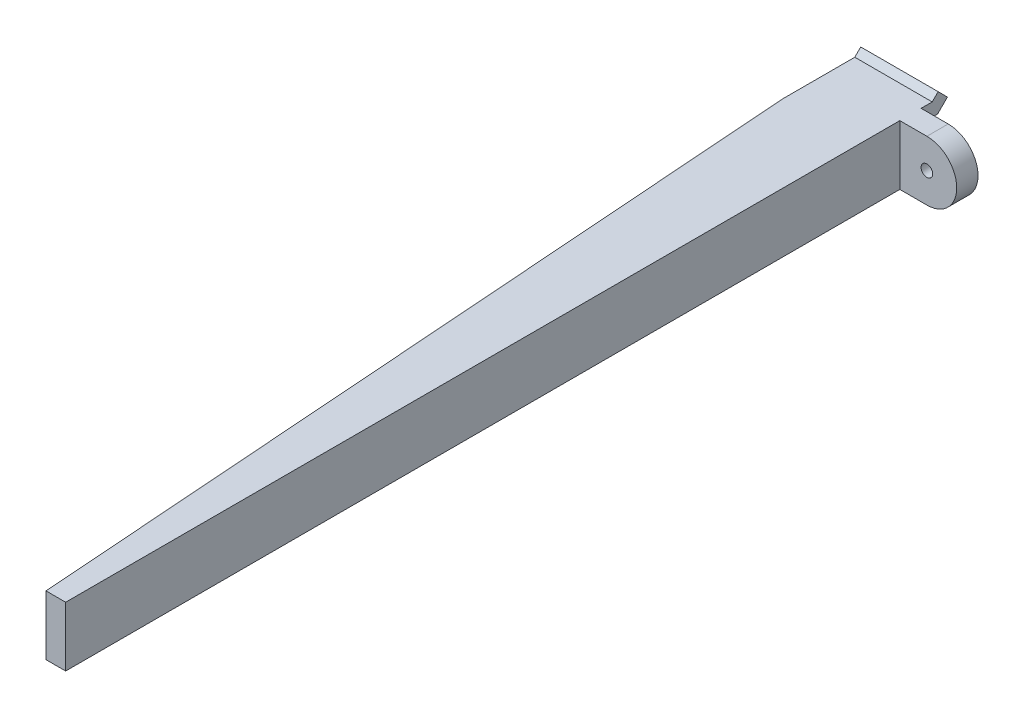
ISO-10303-21;
HEADER;
FILE_DESCRIPTION(('STEP AP214'),'2;1');
FILE_NAME('part.step','',(''),(''),'','','');
FILE_SCHEMA(('AUTOMOTIVE_DESIGN { 1 0 10303 214 1 1 1 1 }'));
ENDSEC;
DATA;
#1=APPLICATION_CONTEXT('core data for automotive mechanical design processes');
#2=APPLICATION_PROTOCOL_DEFINITION('international standard','automotive_design',2000,#1);
#3=PRODUCT_CONTEXT('',#1,'mechanical');
#4=PRODUCT('Part','Part','',(#3));
#5=PRODUCT_RELATED_PRODUCT_CATEGORY('part','',(#4));
#6=PRODUCT_DEFINITION_FORMATION('','',#4);
#7=PRODUCT_DEFINITION_CONTEXT('part definition',#1,'design');
#8=PRODUCT_DEFINITION('design','',#6,#7);
#9=PRODUCT_DEFINITION_SHAPE('','',#8);
#10=(LENGTH_UNIT() NAMED_UNIT(*) SI_UNIT(.MILLI.,.METRE.));
#11=(NAMED_UNIT(*) PLANE_ANGLE_UNIT() SI_UNIT($,.RADIAN.));
#12=(NAMED_UNIT(*) SI_UNIT($,.STERADIAN.) SOLID_ANGLE_UNIT());
#13=UNCERTAINTY_MEASURE_WITH_UNIT(LENGTH_MEASURE(1.E-05),#10,'distance_accuracy_value','');
#14=(GEOMETRIC_REPRESENTATION_CONTEXT(3) GLOBAL_UNCERTAINTY_ASSIGNED_CONTEXT((#13)) GLOBAL_UNIT_ASSIGNED_CONTEXT((#10,
#11,#12)) REPRESENTATION_CONTEXT('',''));
#15=CARTESIAN_POINT('',(0.,0.,0.));
#16=DIRECTION('',(0.,0.,1.));
#17=DIRECTION('',(1.,0.,0.));
#18=AXIS2_PLACEMENT_3D('',#15,#16,#17);
#19=CARTESIAN_POINT('',(5.,-5.8181568544759,5.));
#20=DIRECTION('',(-1.,0.,0.));
#21=DIRECTION('',(0.,0.,1.));
#22=AXIS2_PLACEMENT_3D('',#19,#20,#21);
#23=PLANE('',#22);
#24=DIRECTION('',(0.,0.,1.));
#25=VECTOR('',#24,1.);
#26=CARTESIAN_POINT('',(5.,5.77025558493729,-0.150000000000021));
#27=LINE('',#26,#25);
#28=CARTESIAN_POINT('',(5.,5.77025558493729,-1.43370490960979));
#29=VERTEX_POINT('',#28);
#30=CARTESIAN_POINT('',(5.,5.77025558493729,0.));
#31=VERTEX_POINT('',#30);
#32=EDGE_CURVE('E276',#29,#31,#27,.T.);
#33=ORIENTED_EDGE('',*,*,#32,.T.);
#34=DIRECTION('',(0.,-1.,0.));
#35=VECTOR('',#34,1.);
#36=CARTESIAN_POINT('',(5.,-1.92974441505666,0.));
#37=LINE('',#36,#35);
#38=CARTESIAN_POINT('',(5.,4.07025558493731,0.));
#39=VERTEX_POINT('',#38);
#40=EDGE_CURVE('E190',#31,#39,#37,.T.);
#41=ORIENTED_EDGE('',*,*,#40,.T.);
#42=DIRECTION('',(0.,-1.09865820145183E-13,-1.));
#43=VECTOR('',#42,1.);
#44=CARTESIAN_POINT('',(5.,4.07025558493731,0.));
#45=LINE('',#44,#43);
#46=CARTESIAN_POINT('',(5.,4.07025558493729,-2.13786796564405));
#47=VERTEX_POINT('',#46);
#48=EDGE_CURVE('E250',#39,#47,#45,.T.);
#49=ORIENTED_EDGE('',*,*,#48,.T.);
#50=DIRECTION('',(0.,0.707106781186548,-0.707106781186547));
#51=VECTOR('',#50,1.);
#52=CARTESIAN_POINT('',(5.,5.33446914731039,-3.40208152801715));
#53=LINE('',#52,#51);
#54=CARTESIAN_POINT('',(5.,5.33446914731039,-3.40208152801715));
#55=VERTEX_POINT('',#54);
#56=EDGE_CURVE('E248',#47,#55,#53,.T.);
#57=ORIENTED_EDGE('',*,*,#56,.T.);
#58=DIRECTION('',(0.,0.707106781186546,0.707106781186549));
#59=VECTOR('',#58,1.);
#60=CARTESIAN_POINT('',(5.,6.53655067532751,-2.20000000000002));
#61=LINE('',#60,#59);
#62=CARTESIAN_POINT('',(5.,6.53655067532751,-2.20000000000002));
#63=VERTEX_POINT('',#62);
#64=EDGE_CURVE('E245',#55,#63,#61,.T.);
#65=ORIENTED_EDGE('',*,*,#64,.T.);
#66=DIRECTION('',(0.,-0.707106781186548,0.707106781186547));
#67=VECTOR('',#66,1.);
#68=CARTESIAN_POINT('',(5.,5.77025558493729,-1.43370490960979));
#69=LINE('',#68,#67);
#70=EDGE_CURVE('E243',#63,#29,#69,.T.);
#71=ORIENTED_EDGE('',*,*,#70,.T.);
#72=EDGE_LOOP('',(#33,#41,#49,#57,#65,#71));
#73=FACE_BOUND('',#72,.T.);
#74=ADVANCED_FACE('F33',(#73),#23,.F.);
#75=DIRECTION('',(0.,0.,1.));
#76=VECTOR('',#75,1.);
#77=CARTESIAN_POINT('',(5.,-0.229744415062712,-0.150000000000021));
#78=LINE('',#77,#76);
#79=CARTESIAN_POINT('',(5.,-0.229744415062712,-1.43370490960979));
#80=VERTEX_POINT('',#79);
#81=CARTESIAN_POINT('',(5.,-0.229744415062712,0.));
#82=VERTEX_POINT('',#81);
#83=EDGE_CURVE('E216',#80,#82,#78,.T.);
#84=ORIENTED_EDGE('',*,*,#83,.T.);
#85=CARTESIAN_POINT('',(5.,-1.92974441505666,0.));
#86=VERTEX_POINT('',#85);
#87=EDGE_CURVE('E189',#82,#86,#37,.T.);
#88=ORIENTED_EDGE('',*,*,#87,.T.);
#89=DIRECTION('',(0.,-1.08420217248535E-13,-1.));
#90=VECTOR('',#89,1.);
#91=CARTESIAN_POINT('',(5.,-1.92974441506271,-0.150000000000021));
#92=LINE('',#91,#90);
#93=CARTESIAN_POINT('',(5.,-1.92974441506271,-2.13786796564406));
#94=VERTEX_POINT('',#93);
#95=EDGE_CURVE('E213',#86,#94,#92,.T.);
#96=ORIENTED_EDGE('',*,*,#95,.T.);
#97=DIRECTION('',(0.,0.707106781186549,-0.707106781186546));
#98=VECTOR('',#97,1.);
#99=CARTESIAN_POINT('',(5.,-0.665530852689616,-3.40208152801715));
#100=LINE('',#99,#98);
#101=CARTESIAN_POINT('',(5.,-0.665530852689616,-3.40208152801715));
#102=VERTEX_POINT('',#101);
#103=EDGE_CURVE('E211',#94,#102,#100,.T.);
#104=ORIENTED_EDGE('',*,*,#103,.T.);
#105=DIRECTION('',(0.,0.707106781186548,0.707106781186548));
#106=VECTOR('',#105,1.);
#107=CARTESIAN_POINT('',(5.,0.536550675327514,-2.20000000000002));
#108=LINE('',#107,#106);
#109=CARTESIAN_POINT('',(5.,0.536550675327514,-2.20000000000002));
#110=VERTEX_POINT('',#109);
#111=EDGE_CURVE('E208',#102,#110,#108,.T.);
#112=ORIENTED_EDGE('',*,*,#111,.T.);
#113=DIRECTION('',(0.,-0.707106781186546,0.707106781186549));
#114=VECTOR('',#113,1.);
#115=CARTESIAN_POINT('',(5.,-0.229744415062712,-1.43370490960979));
#116=LINE('',#115,#114);
#117=EDGE_CURVE('E206',#110,#80,#116,.T.);
#118=ORIENTED_EDGE('',*,*,#117,.T.);
#119=EDGE_LOOP('',(#84,#88,#96,#104,#112,#118));
#120=FACE_BOUND('',#119,.T.);
#121=ADVANCED_FACE('F323',(#120),#23,.F.);
#122=CARTESIAN_POINT('',(5.,5.77025558493729,2.75));
#123=VERTEX_POINT('',#122);
#124=CARTESIAN_POINT('',(5.,5.77025558493729,110.5));
#125=VERTEX_POINT('',#124);
#126=EDGE_CURVE('E252',#123,#125,#27,.T.);
#127=ORIENTED_EDGE('',*,*,#126,.T.);
#128=DIRECTION('',(0.,1.,0.));
#129=VECTOR('',#128,1.);
#130=CARTESIAN_POINT('',(5.,5.77025558493729,110.5));
#131=LINE('',#130,#129);
#132=CARTESIAN_POINT('',(5.,-1.92974441506156,110.5));
#133=VERTEX_POINT('',#132);
#134=EDGE_CURVE('E167',#133,#125,#131,.T.);
#135=ORIENTED_EDGE('',*,*,#134,.F.);
#136=CARTESIAN_POINT('',(5.,-1.9297444150624,2.75));
#137=VERTEX_POINT('',#136);
#138=EDGE_CURVE('E214',#133,#137,#92,.T.);
#139=ORIENTED_EDGE('',*,*,#138,.T.);
#140=DIRECTION('',(0.,-1.,0.));
#141=VECTOR('',#140,1.);
#142=CARTESIAN_POINT('',(5.,-1.92974441505666,2.75));
#143=LINE('',#142,#141);
#144=EDGE_CURVE('E55',#123,#137,#143,.T.);
#145=ORIENTED_EDGE('',*,*,#144,.F.);
#146=EDGE_LOOP('',(#127,#135,#139,#145));
#147=FACE_BOUND('',#146,.T.);
#148=ADVANCED_FACE('F35',(#147),#23,.F.);
#149=CARTESIAN_POINT('',(-5.,-5.8181568544759,5.));
#150=DIRECTION('',(1.,0.,0.));
#151=DIRECTION('',(0.,0.,-1.));
#152=AXIS2_PLACEMENT_3D('',#149,#150,#151);
#153=PLANE('',#152);
#154=DIRECTION('',(0.,1.08420217248535E-13,1.));
#155=VECTOR('',#154,1.);
#156=CARTESIAN_POINT('',(-5.,-1.92974441506271,-0.150000000000021));
#157=LINE('',#156,#155);
#158=CARTESIAN_POINT('',(-5.,-1.92974441506271,-2.13786796564406));
#159=VERTEX_POINT('',#158);
#160=CARTESIAN_POINT('',(-5.,-1.92974441505628,7.95281056443287));
#161=VERTEX_POINT('',#160);
#162=EDGE_CURVE('E228',#159,#161,#157,.T.);
#163=ORIENTED_EDGE('',*,*,#162,.T.);
#164=DIRECTION('',(0.,1.,0.));
#165=VECTOR('',#164,1.);
#166=CARTESIAN_POINT('',(-5.,-94.2297444150627,7.95281056443287));
#167=LINE('',#166,#165);
#168=CARTESIAN_POINT('',(-5.,5.77025558493729,7.95281056443287));
#169=VERTEX_POINT('',#168);
#170=EDGE_CURVE('E162',#161,#169,#167,.T.);
#171=ORIENTED_EDGE('',*,*,#170,.T.);
#172=DIRECTION('',(0.,0.,-1.));
#173=VECTOR('',#172,1.);
#174=CARTESIAN_POINT('',(-5.,5.77025558493729,-0.150000000000021));
#175=LINE('',#174,#173);
#176=CARTESIAN_POINT('',(-5.,5.77025558493729,-1.43370490960979));
#177=VERTEX_POINT('',#176);
#178=EDGE_CURVE('E161',#169,#177,#175,.T.);
#179=ORIENTED_EDGE('',*,*,#178,.T.);
#180=DIRECTION('',(0.,0.707106781186548,-0.707106781186547));
#181=VECTOR('',#180,1.);
#182=CARTESIAN_POINT('',(-5.,5.77025558493729,-1.43370490960979));
#183=LINE('',#182,#181);
#184=CARTESIAN_POINT('',(-5.,6.53655067532751,-2.20000000000002));
#185=VERTEX_POINT('',#184);
#186=EDGE_CURVE('E254',#177,#185,#183,.T.);
#187=ORIENTED_EDGE('',*,*,#186,.T.);
#188=DIRECTION('',(0.,-0.707106781186546,-0.707106781186549));
#189=VECTOR('',#188,1.);
#190=CARTESIAN_POINT('',(-5.,6.53655067532751,-2.20000000000002));
#191=LINE('',#190,#189);
#192=CARTESIAN_POINT('',(-5.,5.33446914731039,-3.40208152801715));
#193=VERTEX_POINT('',#192);
#194=EDGE_CURVE('E257',#185,#193,#191,.T.);
#195=ORIENTED_EDGE('',*,*,#194,.T.);
#196=DIRECTION('',(0.,-0.707106781186548,0.707106781186547));
#197=VECTOR('',#196,1.);
#198=CARTESIAN_POINT('',(-5.,5.33446914731039,-3.40208152801715));
#199=LINE('',#198,#197);
#200=CARTESIAN_POINT('',(-5.,4.07025558493729,-2.13786796564405));
#201=VERTEX_POINT('',#200);
#202=EDGE_CURVE('E260',#193,#201,#199,.T.);
#203=ORIENTED_EDGE('',*,*,#202,.T.);
#204=DIRECTION('',(0.,1.09865820145183E-13,1.));
#205=VECTOR('',#204,1.);
#206=CARTESIAN_POINT('',(-5.,4.07025558493731,0.));
#207=LINE('',#206,#205);
#208=CARTESIAN_POINT('',(-5.,4.07025558493731,0.));
#209=VERTEX_POINT('',#208);
#210=EDGE_CURVE('E263',#201,#209,#207,.T.);
#211=ORIENTED_EDGE('',*,*,#210,.T.);
#212=DIRECTION('',(0.,-1.,0.));
#213=VECTOR('',#212,1.);
#214=CARTESIAN_POINT('',(-5.,-5.8181568544759,0.));
#215=LINE('',#214,#213);
#216=CARTESIAN_POINT('',(-5.,-0.229744415062696,0.));
#217=VERTEX_POINT('',#216);
#218=EDGE_CURVE('E41',#209,#217,#215,.T.);
#219=ORIENTED_EDGE('',*,*,#218,.T.);
#220=DIRECTION('',(0.,0.,-1.));
#221=VECTOR('',#220,1.);
#222=CARTESIAN_POINT('',(-5.,-0.229744415062712,-0.150000000000021));
#223=LINE('',#222,#221);
#224=CARTESIAN_POINT('',(-5.,-0.229744415062712,-1.43370490960979));
#225=VERTEX_POINT('',#224);
#226=EDGE_CURVE('E204',#217,#225,#223,.T.);
#227=ORIENTED_EDGE('',*,*,#226,.T.);
#228=DIRECTION('',(0.,0.707106781186546,-0.707106781186549));
#229=VECTOR('',#228,1.);
#230=CARTESIAN_POINT('',(-5.,-0.229744415062712,-1.43370490960979));
#231=LINE('',#230,#229);
#232=CARTESIAN_POINT('',(-5.,0.536550675327514,-2.20000000000002));
#233=VERTEX_POINT('',#232);
#234=EDGE_CURVE('E219',#225,#233,#231,.T.);
#235=ORIENTED_EDGE('',*,*,#234,.T.);
#236=DIRECTION('',(0.,-0.707106781186548,-0.707106781186548));
#237=VECTOR('',#236,1.);
#238=CARTESIAN_POINT('',(-5.,0.536550675327514,-2.20000000000002));
#239=LINE('',#238,#237);
#240=CARTESIAN_POINT('',(-5.,-0.665530852689616,-3.40208152801715));
#241=VERTEX_POINT('',#240);
#242=EDGE_CURVE('E222',#233,#241,#239,.T.);
#243=ORIENTED_EDGE('',*,*,#242,.T.);
#244=DIRECTION('',(0.,-0.707106781186549,0.707106781186546));
#245=VECTOR('',#244,1.);
#246=CARTESIAN_POINT('',(-5.,-0.665530852689616,-3.40208152801715));
#247=LINE('',#246,#245);
#248=EDGE_CURVE('E225',#241,#159,#247,.T.);
#249=ORIENTED_EDGE('',*,*,#248,.T.);
#250=EDGE_LOOP('',(#163,#171,#179,#187,#195,#203,#211,#219,#227,#235,#243,#249));
#251=FACE_BOUND('',#250,.T.);
#252=ADVANCED_FACE('F279',(#251),#153,.F.);
#253=CARTESIAN_POINT('',(0.,0.,0.));
#254=DIRECTION('',(0.,0.,-1.));
#255=DIRECTION('',(-1.,0.,0.));
#256=AXIS2_PLACEMENT_3D('',#253,#254,#255);
#257=PLANE('',#256);
#258=DIRECTION('',(-1.,0.,0.));
#259=VECTOR('',#258,1.);
#260=CARTESIAN_POINT('',(9.20199597764663,-0.229744415062696,0.));
#261=LINE('',#260,#259);
#262=EDGE_CURVE('E231',#82,#217,#261,.T.);
#263=ORIENTED_EDGE('',*,*,#262,.T.);
#264=ORIENTED_EDGE('',*,*,#218,.F.);
#265=DIRECTION('',(-1.,0.,0.));
#266=VECTOR('',#265,1.);
#267=CARTESIAN_POINT('',(9.20199597764663,4.07025558493731,0.));
#268=LINE('',#267,#266);
#269=EDGE_CURVE('E246',#39,#209,#268,.T.);
#270=ORIENTED_EDGE('',*,*,#269,.F.);
#271=ORIENTED_EDGE('',*,*,#40,.F.);
#272=DIRECTION('',(-1.,0.,0.));
#273=VECTOR('',#272,1.);
#274=CARTESIAN_POINT('',(5.,5.7702555849373,0.));
#275=LINE('',#274,#273);
#276=CARTESIAN_POINT('',(8.5,5.7702555849373,0.));
#277=VERTEX_POINT('',#276);
#278=EDGE_CURVE('E198',#277,#31,#275,.T.);
#279=ORIENTED_EDGE('',*,*,#278,.F.);
#280=CARTESIAN_POINT('',(8.5,1.92025558494031,0.));
#281=DIRECTION('',(0.,0.,1.));
#282=DIRECTION('',(-1.,0.,0.));
#283=AXIS2_PLACEMENT_3D('',#280,#281,#282);
#284=CIRCLE('',#283,3.84999999999698);
#285=CARTESIAN_POINT('',(8.5,-1.92974441505667,0.));
#286=VERTEX_POINT('',#285);
#287=EDGE_CURVE('E195',#286,#277,#284,.T.);
#288=ORIENTED_EDGE('',*,*,#287,.F.);
#289=DIRECTION('',(1.,0.,0.));
#290=VECTOR('',#289,1.);
#291=CARTESIAN_POINT('',(8.5,-1.92974441505666,0.));
#292=LINE('',#291,#290);
#293=EDGE_CURVE('E192',#86,#286,#292,.T.);
#294=ORIENTED_EDGE('',*,*,#293,.F.);
#295=ORIENTED_EDGE('',*,*,#87,.F.);
#296=EDGE_LOOP('',(#263,#264,#270,#271,#279,#288,#294,#295));
#297=FACE_BOUND('',#296,.T.);
#298=CARTESIAN_POINT('',(8.5,1.92025558494031,0.));
#299=DIRECTION('',(0.,0.,1.));
#300=DIRECTION('',(1.,0.,0.));
#301=AXIS2_PLACEMENT_3D('',#298,#299,#300);
#302=CIRCLE('',#301,0.750000000001459);
#303=CARTESIAN_POINT('',(9.25000000000146,1.92025558494031,0.));
#304=VERTEX_POINT('',#303);
#305=EDGE_CURVE('E186',#304,#304,#302,.T.);
#306=ORIENTED_EDGE('',*,*,#305,.T.);
#307=EDGE_LOOP('',(#306));
#308=FACE_BOUND('',#307,.T.);
#309=ADVANCED_FACE('F283',(#297,#308),#257,.T.);
#310=CARTESIAN_POINT('',(9.20199597764663,4.07025558493731,0.));
#311=DIRECTION('',(0.,-1.,1.09865820145183E-13));
#312=DIRECTION('',(0.,-1.09865820145183E-13,-1.));
#313=AXIS2_PLACEMENT_3D('',#310,#311,#312);
#314=PLANE('',#313);
#315=ORIENTED_EDGE('',*,*,#48,.F.);
#316=ORIENTED_EDGE('',*,*,#269,.T.);
#317=ORIENTED_EDGE('',*,*,#210,.F.);
#318=DIRECTION('',(-1.,0.,0.));
#319=VECTOR('',#318,1.);
#320=CARTESIAN_POINT('',(9.20199597764663,4.07025558493729,-2.13786796564405));
#321=LINE('',#320,#319);
#322=EDGE_CURVE('E269',#47,#201,#321,.T.);
#323=ORIENTED_EDGE('',*,*,#322,.F.);
#324=EDGE_LOOP('',(#315,#316,#317,#323));
#325=FACE_BOUND('',#324,.T.);
#326=ADVANCED_FACE('F289',(#325),#314,.T.);
#327=CARTESIAN_POINT('',(9.20199597764663,5.33446914731039,-3.40208152801715));
#328=DIRECTION('',(0.,-0.707106781186547,-0.707106781186548));
#329=DIRECTION('',(0.,0.707106781186548,-0.707106781186547));
#330=AXIS2_PLACEMENT_3D('',#327,#328,#329);
#331=PLANE('',#330);
#332=ORIENTED_EDGE('',*,*,#56,.F.);
#333=ORIENTED_EDGE('',*,*,#322,.T.);
#334=ORIENTED_EDGE('',*,*,#202,.F.);
#335=DIRECTION('',(-1.,0.,0.));
#336=VECTOR('',#335,1.);
#337=CARTESIAN_POINT('',(9.20199597764663,5.33446914731039,-3.40208152801715));
#338=LINE('',#337,#336);
#339=EDGE_CURVE('E271',#55,#193,#338,.T.);
#340=ORIENTED_EDGE('',*,*,#339,.F.);
#341=EDGE_LOOP('',(#332,#333,#334,#340));
#342=FACE_BOUND('',#341,.T.);
#343=ADVANCED_FACE('F296',(#342),#331,.T.);
#344=CARTESIAN_POINT('',(9.20199597764663,6.53655067532751,-2.20000000000002));
#345=DIRECTION('',(0.,0.707106781186549,-0.707106781186546));
#346=DIRECTION('',(0.,0.707106781186546,0.707106781186549));
#347=AXIS2_PLACEMENT_3D('',#344,#345,#346);
#348=PLANE('',#347);
#349=ORIENTED_EDGE('',*,*,#64,.F.);
#350=ORIENTED_EDGE('',*,*,#339,.T.);
#351=ORIENTED_EDGE('',*,*,#194,.F.);
#352=DIRECTION('',(-1.,0.,0.));
#353=VECTOR('',#352,1.);
#354=CARTESIAN_POINT('',(9.20199597764663,6.53655067532751,-2.20000000000002));
#355=LINE('',#354,#353);
#356=EDGE_CURVE('E273',#63,#185,#355,.T.);
#357=ORIENTED_EDGE('',*,*,#356,.F.);
#358=EDGE_LOOP('',(#349,#350,#351,#357));
#359=FACE_BOUND('',#358,.T.);
#360=ADVANCED_FACE('F300',(#359),#348,.T.);
#361=CARTESIAN_POINT('',(9.20199597764663,5.77025558493729,-1.43370490960979));
#362=DIRECTION('',(0.,0.707106781186547,0.707106781186548));
#363=DIRECTION('',(0.,-0.707106781186548,0.707106781186547));
#364=AXIS2_PLACEMENT_3D('',#361,#362,#363);
#365=PLANE('',#364);
#366=ORIENTED_EDGE('',*,*,#70,.F.);
#367=ORIENTED_EDGE('',*,*,#356,.T.);
#368=ORIENTED_EDGE('',*,*,#186,.F.);
#369=DIRECTION('',(-1.,0.,0.));
#370=VECTOR('',#369,1.);
#371=CARTESIAN_POINT('',(9.20199597764663,5.77025558493729,-1.43370490960979));
#372=LINE('',#371,#370);
#373=EDGE_CURVE('E266',#29,#177,#372,.T.);
#374=ORIENTED_EDGE('',*,*,#373,.F.);
#375=EDGE_LOOP('',(#366,#367,#368,#374));
#376=FACE_BOUND('',#375,.T.);
#377=ADVANCED_FACE('F305',(#376),#365,.T.);
#378=CARTESIAN_POINT('',(9.20199597764663,5.77025558493729,-0.150000000000021));
#379=DIRECTION('',(0.,1.,0.));
#380=DIRECTION('',(0.,0.,1.));
#381=AXIS2_PLACEMENT_3D('',#378,#379,#380);
#382=PLANE('',#381);
#383=DIRECTION('',(-0.0725670682557861,0.,-0.997363534828079));
#384=VECTOR('',#383,1.);
#385=CARTESIAN_POINT('',(-5.,5.77025558493729,7.95281056443287));
#386=LINE('',#385,#384);
#387=CARTESIAN_POINT('',(2.46122014225492,5.77025558493729,110.5));
#388=VERTEX_POINT('',#387);
#389=EDGE_CURVE('E150',#388,#169,#386,.T.);
#390=ORIENTED_EDGE('',*,*,#389,.F.);
#391=DIRECTION('',(-1.,0.,0.));
#392=VECTOR('',#391,1.);
#393=CARTESIAN_POINT('',(-5.,5.77025558493729,110.5));
#394=LINE('',#393,#392);
#395=EDGE_CURVE('E159',#125,#388,#394,.T.);
#396=ORIENTED_EDGE('',*,*,#395,.F.);
#397=ORIENTED_EDGE('',*,*,#126,.F.);
#398=DIRECTION('',(-1.,0.,0.));
#399=VECTOR('',#398,1.);
#400=CARTESIAN_POINT('',(5.,5.7702555849373,2.75));
#401=LINE('',#400,#399);
#402=CARTESIAN_POINT('',(8.5,5.7702555849373,2.75));
#403=VERTEX_POINT('',#402);
#404=EDGE_CURVE('E171',#403,#123,#401,.T.);
#405=ORIENTED_EDGE('',*,*,#404,.F.);
#406=DIRECTION('',(0.,0.,-1.));
#407=VECTOR('',#406,1.);
#408=CARTESIAN_POINT('',(8.5,5.7702555849373,13.3948344280154));
#409=LINE('',#408,#407);
#410=EDGE_CURVE('E201',#403,#277,#409,.T.);
#411=ORIENTED_EDGE('',*,*,#410,.T.);
#412=ORIENTED_EDGE('',*,*,#278,.T.);
#413=ORIENTED_EDGE('',*,*,#32,.F.);
#414=ORIENTED_EDGE('',*,*,#373,.T.);
#415=ORIENTED_EDGE('',*,*,#178,.F.);
#416=EDGE_LOOP('',(#390,#396,#397,#405,#411,#412,#413,#414,#415));
#417=FACE_BOUND('',#416,.T.);
#418=ADVANCED_FACE('F158',(#417),#382,.T.);
#419=CARTESIAN_POINT('',(9.20199597764663,-1.92974441506271,-0.150000000000021));
#420=DIRECTION('',(0.,-1.,1.08420217248535E-13));
#421=DIRECTION('',(0.,-1.08420217248535E-13,-1.));
#422=AXIS2_PLACEMENT_3D('',#419,#420,#421);
#423=PLANE('',#422);
#424=DIRECTION('',(0.0725670682557861,1.08134371121827E-13,0.997363534828079));
#425=VECTOR('',#424,1.);
#426=CARTESIAN_POINT('',(-5.51165955494513,-1.92974441506259,0.920549311299755));
#427=LINE('',#426,#425);
#428=CARTESIAN_POINT('',(2.46122014225492,-1.92974441506156,110.5));
#429=VERTEX_POINT('',#428);
#430=EDGE_CURVE('E47',#161,#429,#427,.T.);
#431=ORIENTED_EDGE('',*,*,#430,.F.);
#432=ORIENTED_EDGE('',*,*,#162,.F.);
#433=DIRECTION('',(-1.,0.,0.));
#434=VECTOR('',#433,1.);
#435=CARTESIAN_POINT('',(9.20199597764663,-1.92974441506271,-2.13786796564406));
#436=LINE('',#435,#434);
#437=EDGE_CURVE('E209',#94,#159,#436,.T.);
#438=ORIENTED_EDGE('',*,*,#437,.F.);
#439=ORIENTED_EDGE('',*,*,#95,.F.);
#440=ORIENTED_EDGE('',*,*,#293,.T.);
#441=DIRECTION('',(0.,0.,-1.));
#442=VECTOR('',#441,1.);
#443=CARTESIAN_POINT('',(8.5,-1.92974441505667,13.3948344280154));
#444=LINE('',#443,#442);
#445=CARTESIAN_POINT('',(8.5,-1.92974441505667,2.75));
#446=VERTEX_POINT('',#445);
#447=EDGE_CURVE('E203',#446,#286,#444,.T.);
#448=ORIENTED_EDGE('',*,*,#447,.F.);
#449=DIRECTION('',(1.,0.,0.));
#450=VECTOR('',#449,1.);
#451=CARTESIAN_POINT('',(8.5,-1.92974441505666,2.75));
#452=LINE('',#451,#450);
#453=EDGE_CURVE('E182',#137,#446,#452,.T.);
#454=ORIENTED_EDGE('',*,*,#453,.F.);
#455=ORIENTED_EDGE('',*,*,#138,.F.);
#456=DIRECTION('',(1.,0.,0.));
#457=VECTOR('',#456,1.);
#458=CARTESIAN_POINT('',(-5.,-1.92974441506156,110.5));
#459=LINE('',#458,#457);
#460=EDGE_CURVE('E173',#429,#133,#459,.T.);
#461=ORIENTED_EDGE('',*,*,#460,.F.);
#462=EDGE_LOOP('',(#431,#432,#438,#439,#440,#448,#454,#455,#461));
#463=FACE_BOUND('',#462,.T.);
#464=ADVANCED_FACE('F317',(#463),#423,.T.);
#465=CARTESIAN_POINT('',(9.20199597764663,-0.665530852689616,-3.40208152801715));
#466=DIRECTION('',(0.,-0.707106781186546,-0.707106781186549));
#467=DIRECTION('',(0.,0.707106781186549,-0.707106781186546));
#468=AXIS2_PLACEMENT_3D('',#465,#466,#467);
#469=PLANE('',#468);
#470=ORIENTED_EDGE('',*,*,#103,.F.);
#471=ORIENTED_EDGE('',*,*,#437,.T.);
#472=ORIENTED_EDGE('',*,*,#248,.F.);
#473=DIRECTION('',(-1.,0.,0.));
#474=VECTOR('',#473,1.);
#475=CARTESIAN_POINT('',(9.20199597764663,-0.665530852689616,-3.40208152801715));
#476=LINE('',#475,#474);
#477=EDGE_CURVE('E233',#102,#241,#476,.T.);
#478=ORIENTED_EDGE('',*,*,#477,.F.);
#479=EDGE_LOOP('',(#470,#471,#472,#478));
#480=FACE_BOUND('',#479,.T.);
#481=ADVANCED_FACE('F340',(#480),#469,.T.);
#482=CARTESIAN_POINT('',(9.20199597764663,0.536550675327514,-2.20000000000002));
#483=DIRECTION('',(0.,0.707106781186547,-0.707106781186547));
#484=DIRECTION('',(0.,0.707106781186548,0.707106781186548));
#485=AXIS2_PLACEMENT_3D('',#482,#483,#484);
#486=PLANE('',#485);
#487=ORIENTED_EDGE('',*,*,#111,.F.);
#488=ORIENTED_EDGE('',*,*,#477,.T.);
#489=ORIENTED_EDGE('',*,*,#242,.F.);
#490=DIRECTION('',(-1.,0.,0.));
#491=VECTOR('',#490,1.);
#492=CARTESIAN_POINT('',(9.20199597764663,0.536550675327514,-2.20000000000002));
#493=LINE('',#492,#491);
#494=EDGE_CURVE('E235',#110,#233,#493,.T.);
#495=ORIENTED_EDGE('',*,*,#494,.F.);
#496=EDGE_LOOP('',(#487,#488,#489,#495));
#497=FACE_BOUND('',#496,.T.);
#498=ADVANCED_FACE('F337',(#497),#486,.T.);
#499=CARTESIAN_POINT('',(9.20199597764663,-0.229744415062712,-1.43370490960979));
#500=DIRECTION('',(0.,0.707106781186549,0.707106781186546));
#501=DIRECTION('',(0.,-0.707106781186546,0.707106781186549));
#502=AXIS2_PLACEMENT_3D('',#499,#500,#501);
#503=PLANE('',#502);
#504=ORIENTED_EDGE('',*,*,#117,.F.);
#505=ORIENTED_EDGE('',*,*,#494,.T.);
#506=ORIENTED_EDGE('',*,*,#234,.F.);
#507=DIRECTION('',(-1.,0.,0.));
#508=VECTOR('',#507,1.);
#509=CARTESIAN_POINT('',(9.20199597764663,-0.229744415062712,-1.43370490960979));
#510=LINE('',#509,#508);
#511=EDGE_CURVE('E237',#80,#225,#510,.T.);
#512=ORIENTED_EDGE('',*,*,#511,.F.);
#513=EDGE_LOOP('',(#504,#505,#506,#512));
#514=FACE_BOUND('',#513,.T.);
#515=ADVANCED_FACE('F331',(#514),#503,.T.);
#516=CARTESIAN_POINT('',(9.20199597764663,-0.229744415062712,-0.150000000000021));
#517=DIRECTION('',(0.,1.,0.));
#518=DIRECTION('',(0.,0.,1.));
#519=AXIS2_PLACEMENT_3D('',#516,#517,#518);
#520=PLANE('',#519);
#521=ORIENTED_EDGE('',*,*,#83,.F.);
#522=ORIENTED_EDGE('',*,*,#511,.T.);
#523=ORIENTED_EDGE('',*,*,#226,.F.);
#524=ORIENTED_EDGE('',*,*,#262,.F.);
#525=EDGE_LOOP('',(#521,#522,#523,#524));
#526=FACE_BOUND('',#525,.T.);
#527=ADVANCED_FACE('F328',(#526),#520,.T.);
#528=CARTESIAN_POINT('',(8.5,1.92025558494031,13.3948344280154));
#529=DIRECTION('',(0.,0.,-1.));
#530=DIRECTION('',(-1.,0.,0.));
#531=AXIS2_PLACEMENT_3D('',#528,#529,#530);
#532=CYLINDRICAL_SURFACE('',#531,3.84999999999698);
#533=CARTESIAN_POINT('',(8.5,1.92025558494031,2.75));
#534=DIRECTION('',(0.,0.,1.));
#535=DIRECTION('',(1.,0.,0.));
#536=AXIS2_PLACEMENT_3D('',#533,#534,#535);
#537=CIRCLE('',#536,3.84999999999698);
#538=EDGE_CURVE('E179',#446,#403,#537,.T.);
#539=ORIENTED_EDGE('',*,*,#538,.F.);
#540=ORIENTED_EDGE('',*,*,#447,.T.);
#541=ORIENTED_EDGE('',*,*,#287,.T.);
#542=ORIENTED_EDGE('',*,*,#410,.F.);
#543=EDGE_LOOP('',(#539,#540,#541,#542));
#544=FACE_BOUND('',#543,.T.);
#545=ADVANCED_FACE('F313',(#544),#532,.T.);
#546=CARTESIAN_POINT('',(8.5,1.92025558494031,13.3948344280154));
#547=DIRECTION('',(0.,0.,-1.));
#548=DIRECTION('',(-1.,0.,0.));
#549=AXIS2_PLACEMENT_3D('',#546,#547,#548);
#550=CYLINDRICAL_SURFACE('',#549,0.750000000001459);
#551=ORIENTED_EDGE('',*,*,#305,.F.);
#552=EDGE_LOOP('',(#551));
#553=FACE_BOUND('',#552,.T.);
#554=CARTESIAN_POINT('',(8.5,1.92025558494031,2.75));
#555=DIRECTION('',(0.,0.,1.));
#556=DIRECTION('',(1.,0.,0.));
#557=AXIS2_PLACEMENT_3D('',#554,#555,#556);
#558=CIRCLE('',#557,0.750000000001459);
#559=CARTESIAN_POINT('',(9.25000000000146,1.92025558494031,2.75));
#560=VERTEX_POINT('',#559);
#561=EDGE_CURVE('E168',#560,#560,#558,.T.);
#562=ORIENTED_EDGE('',*,*,#561,.T.);
#563=EDGE_LOOP('',(#562));
#564=FACE_BOUND('',#563,.T.);
#565=ADVANCED_FACE('F347',(#553,#564),#550,.F.);
#566=CARTESIAN_POINT('',(0.,0.,2.75));
#567=DIRECTION('',(0.,0.,1.));
#568=DIRECTION('',(1.,0.,0.));
#569=AXIS2_PLACEMENT_3D('',#566,#567,#568);
#570=PLANE('',#569);
#571=ORIENTED_EDGE('',*,*,#561,.F.);
#572=EDGE_LOOP('',(#571));
#573=FACE_BOUND('',#572,.T.);
#574=ORIENTED_EDGE('',*,*,#404,.T.);
#575=ORIENTED_EDGE('',*,*,#144,.T.);
#576=ORIENTED_EDGE('',*,*,#453,.T.);
#577=ORIENTED_EDGE('',*,*,#538,.T.);
#578=EDGE_LOOP('',(#574,#575,#576,#577));
#579=FACE_BOUND('',#578,.T.);
#580=ADVANCED_FACE('F345',(#573,#579),#570,.T.);
#581=CARTESIAN_POINT('',(0.,0.,110.5));
#582=DIRECTION('',(0.,0.,1.));
#583=DIRECTION('',(1.,0.,0.));
#584=AXIS2_PLACEMENT_3D('',#581,#582,#583);
#585=PLANE('',#584);
#586=DIRECTION('',(0.,1.,0.));
#587=VECTOR('',#586,1.);
#588=CARTESIAN_POINT('',(2.46122014225492,0.,110.5));
#589=LINE('',#588,#587);
#590=EDGE_CURVE('E11',#429,#388,#589,.T.);
#591=ORIENTED_EDGE('',*,*,#590,.F.);
#592=ORIENTED_EDGE('',*,*,#460,.T.);
#593=ORIENTED_EDGE('',*,*,#134,.T.);
#594=ORIENTED_EDGE('',*,*,#395,.T.);
#595=EDGE_LOOP('',(#591,#592,#593,#594));
#596=FACE_BOUND('',#595,.T.);
#597=ADVANCED_FACE('F165',(#596),#585,.T.);
#598=CARTESIAN_POINT('',(-5.,-94.2297444150627,7.95281056443287));
#599=DIRECTION('',(0.997363534828079,0.,-0.0725670682557861));
#600=DIRECTION('',(-0.0725670682557861,0.,-0.997363534828079));
#601=AXIS2_PLACEMENT_3D('',#598,#599,#600);
#602=PLANE('',#601);
#603=ORIENTED_EDGE('',*,*,#430,.T.);
#604=ORIENTED_EDGE('',*,*,#590,.T.);
#605=ORIENTED_EDGE('',*,*,#389,.T.);
#606=ORIENTED_EDGE('',*,*,#170,.F.);
#607=EDGE_LOOP('',(#603,#604,#605,#606));
#608=FACE_BOUND('',#607,.T.);
#609=ADVANCED_FACE('F149',(#608),#602,.F.);
#610=CLOSED_SHELL('',(#74,#121,#148,#252,#309,#326,#343,#360,#377,#418,#464,#481,#498,#515,#527,
#545,#565,#580,#597,#609));
#611=MANIFOLD_SOLID_BREP('B2',#610);
#612=ADVANCED_BREP_SHAPE_REPRESENTATION('',(#18,#611),#14);
#613=SHAPE_DEFINITION_REPRESENTATION(#9,#612);
ENDSEC;
END-ISO-10303-21;
